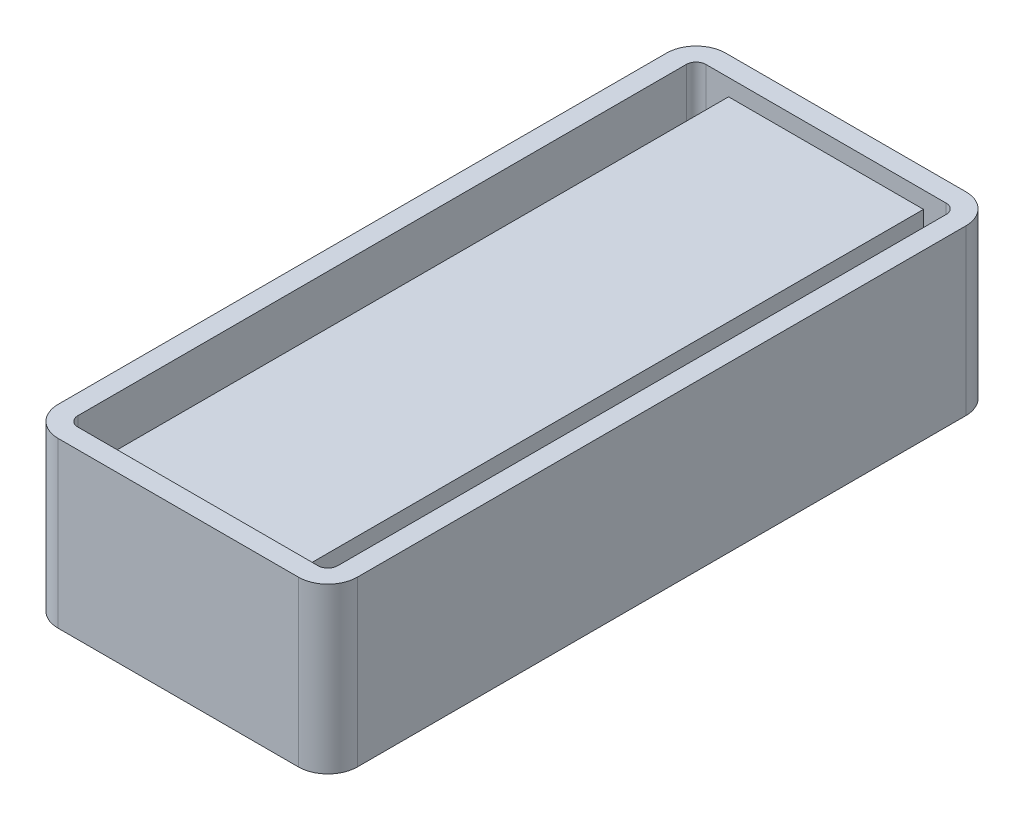
ISO-10303-21;
HEADER;
FILE_DESCRIPTION(('STEP AP214'),'2;1');
FILE_NAME('part.step','',(''),(''),'','','');
FILE_SCHEMA(('AUTOMOTIVE_DESIGN { 1 0 10303 214 1 1 1 1 }'));
ENDSEC;
DATA;
#1=APPLICATION_CONTEXT('core data for automotive mechanical design processes');
#2=APPLICATION_PROTOCOL_DEFINITION('international standard','automotive_design',2000,#1);
#3=PRODUCT_CONTEXT('',#1,'mechanical');
#4=PRODUCT('Part','Part','',(#3));
#5=PRODUCT_RELATED_PRODUCT_CATEGORY('part','',(#4));
#6=PRODUCT_DEFINITION_FORMATION('','',#4);
#7=PRODUCT_DEFINITION_CONTEXT('part definition',#1,'design');
#8=PRODUCT_DEFINITION('design','',#6,#7);
#9=PRODUCT_DEFINITION_SHAPE('','',#8);
#10=(LENGTH_UNIT() NAMED_UNIT(*) SI_UNIT(.MILLI.,.METRE.));
#11=(NAMED_UNIT(*) PLANE_ANGLE_UNIT() SI_UNIT($,.RADIAN.));
#12=(NAMED_UNIT(*) SI_UNIT($,.STERADIAN.) SOLID_ANGLE_UNIT());
#13=UNCERTAINTY_MEASURE_WITH_UNIT(LENGTH_MEASURE(1.E-05),#10,'distance_accuracy_value','');
#14=(GEOMETRIC_REPRESENTATION_CONTEXT(3) GLOBAL_UNCERTAINTY_ASSIGNED_CONTEXT((#13)) GLOBAL_UNIT_ASSIGNED_CONTEXT((#10,
#11,#12)) REPRESENTATION_CONTEXT('',''));
#15=CARTESIAN_POINT('',(0.,0.,0.));
#16=DIRECTION('',(0.,0.,1.));
#17=DIRECTION('',(1.,0.,0.));
#18=AXIS2_PLACEMENT_3D('',#15,#16,#17);
#19=CARTESIAN_POINT('',(0.,15.,0.));
#20=DIRECTION('',(0.,1.,0.));
#21=DIRECTION('',(0.,0.,1.));
#22=AXIS2_PLACEMENT_3D('',#19,#20,#21);
#23=PLANE('',#22);
#24=DIRECTION('',(0.,0.,1.));
#25=VECTOR('',#24,1.);
#26=CARTESIAN_POINT('',(9.9,15.,0.));
#27=LINE('',#26,#25);
#28=CARTESIAN_POINT('',(9.9,15.,-31.9));
#29=VERTEX_POINT('',#28);
#30=CARTESIAN_POINT('',(9.89999999999998,15.,31.9));
#31=VERTEX_POINT('',#30);
#32=EDGE_CURVE('E245',#29,#31,#27,.T.);
#33=ORIENTED_EDGE('',*,*,#32,.F.);
#34=DIRECTION('',(-1.,0.,0.));
#35=VECTOR('',#34,1.);
#36=CARTESIAN_POINT('',(12.2,15.,-31.9));
#37=LINE('',#36,#35);
#38=CARTESIAN_POINT('',(-9.89999999999999,15.,-31.9));
#39=VERTEX_POINT('',#38);
#40=EDGE_CURVE('E11',#29,#39,#37,.T.);
#41=ORIENTED_EDGE('',*,*,#40,.T.);
#42=DIRECTION('',(0.,0.,1.));
#43=VECTOR('',#42,1.);
#44=CARTESIAN_POINT('',(-9.9,15.,0.));
#45=LINE('',#44,#43);
#46=CARTESIAN_POINT('',(-9.9,15.,31.9));
#47=VERTEX_POINT('',#46);
#48=EDGE_CURVE('E248',#39,#47,#45,.T.);
#49=ORIENTED_EDGE('',*,*,#48,.T.);
#50=DIRECTION('',(1.,0.,0.));
#51=VECTOR('',#50,1.);
#52=CARTESIAN_POINT('',(-12.2,15.,31.9));
#53=LINE('',#52,#51);
#54=EDGE_CURVE('E46',#47,#31,#53,.T.);
#55=ORIENTED_EDGE('',*,*,#54,.T.);
#56=EDGE_LOOP('',(#33,#41,#49,#55));
#57=FACE_BOUND('',#56,.T.);
#58=ADVANCED_FACE('F37',(#57),#23,.T.);
#59=CARTESIAN_POINT('',(0.,15.,-33.9));
#60=DIRECTION('',(0.,0.,-1.));
#61=DIRECTION('',(-1.,0.,0.));
#62=AXIS2_PLACEMENT_3D('',#59,#60,#61);
#63=PLANE('',#62);
#64=DIRECTION('',(1.,0.,0.));
#65=VECTOR('',#64,1.);
#66=CARTESIAN_POINT('',(0.,0.,-33.9));
#67=LINE('',#66,#65);
#68=CARTESIAN_POINT('',(-12.2,0.,-33.9));
#69=VERTEX_POINT('',#68);
#70=CARTESIAN_POINT('',(12.2,0.,-33.9));
#71=VERTEX_POINT('',#70);
#72=EDGE_CURVE('E281',#69,#71,#67,.T.);
#73=ORIENTED_EDGE('',*,*,#72,.F.);
#74=DIRECTION('',(0.,-1.,0.));
#75=VECTOR('',#74,1.);
#76=CARTESIAN_POINT('',(-12.2,15.,-33.9));
#77=LINE('',#76,#75);
#78=CARTESIAN_POINT('',(-12.2,16.7,-33.9));
#79=VERTEX_POINT('',#78);
#80=EDGE_CURVE('E220',#79,#69,#77,.T.);
#81=ORIENTED_EDGE('',*,*,#80,.F.);
#82=DIRECTION('',(-1.,0.,0.));
#83=VECTOR('',#82,1.);
#84=CARTESIAN_POINT('',(12.2,16.7,-33.9));
#85=LINE('',#84,#83);
#86=CARTESIAN_POINT('',(12.2,16.7,-33.9));
#87=VERTEX_POINT('',#86);
#88=EDGE_CURVE('E223',#87,#79,#85,.T.);
#89=ORIENTED_EDGE('',*,*,#88,.F.);
#90=DIRECTION('',(0.,-1.,0.));
#91=VECTOR('',#90,1.);
#92=CARTESIAN_POINT('',(12.2,15.,-33.9));
#93=LINE('',#92,#91);
#94=EDGE_CURVE('E54',#87,#71,#93,.T.);
#95=ORIENTED_EDGE('',*,*,#94,.T.);
#96=EDGE_LOOP('',(#73,#81,#89,#95));
#97=FACE_BOUND('',#96,.T.);
#98=ADVANCED_FACE('F378',(#97),#63,.T.);
#99=CARTESIAN_POINT('',(-12.2,15.,-30.9));
#100=DIRECTION('',(0.,-1.,0.));
#101=DIRECTION('',(0.,0.,-1.));
#102=AXIS2_PLACEMENT_3D('',#99,#100,#101);
#103=CYLINDRICAL_SURFACE('',#102,3.);
#104=CARTESIAN_POINT('',(-12.2,0.,-30.9));
#105=DIRECTION('',(0.,1.,0.));
#106=DIRECTION('',(0.,0.,1.));
#107=AXIS2_PLACEMENT_3D('',#104,#105,#106);
#108=CIRCLE('',#107,3.);
#109=CARTESIAN_POINT('',(-15.2,0.,-30.9));
#110=VERTEX_POINT('',#109);
#111=EDGE_CURVE('E283',#69,#110,#108,.T.);
#112=ORIENTED_EDGE('',*,*,#111,.T.);
#113=DIRECTION('',(0.,-1.,0.));
#114=VECTOR('',#113,1.);
#115=CARTESIAN_POINT('',(-15.2,15.,-30.9));
#116=LINE('',#115,#114);
#117=CARTESIAN_POINT('',(-15.2,16.7,-30.9));
#118=VERTEX_POINT('',#117);
#119=EDGE_CURVE('E317',#118,#110,#116,.T.);
#120=ORIENTED_EDGE('',*,*,#119,.F.);
#121=CARTESIAN_POINT('',(-12.2,16.7,-30.9));
#122=DIRECTION('',(0.,1.,0.));
#123=DIRECTION('',(0.,0.,1.));
#124=AXIS2_PLACEMENT_3D('',#121,#122,#123);
#125=CIRCLE('',#124,3.);
#126=EDGE_CURVE('E226',#79,#118,#125,.T.);
#127=ORIENTED_EDGE('',*,*,#126,.F.);
#128=ORIENTED_EDGE('',*,*,#80,.T.);
#129=EDGE_LOOP('',(#112,#120,#127,#128));
#130=FACE_BOUND('',#129,.T.);
#131=ADVANCED_FACE('F383',(#130),#103,.T.);
#132=CARTESIAN_POINT('',(-15.2,15.,0.));
#133=DIRECTION('',(1.,0.,0.));
#134=DIRECTION('',(0.,0.,-1.));
#135=AXIS2_PLACEMENT_3D('',#132,#133,#134);
#136=PLANE('',#135);
#137=DIRECTION('',(0.,0.,1.));
#138=VECTOR('',#137,1.);
#139=CARTESIAN_POINT('',(-15.2,0.,0.));
#140=LINE('',#139,#138);
#141=CARTESIAN_POINT('',(-15.2,0.,30.9));
#142=VERTEX_POINT('',#141);
#143=EDGE_CURVE('E286',#110,#142,#140,.T.);
#144=ORIENTED_EDGE('',*,*,#143,.T.);
#145=DIRECTION('',(0.,-1.,0.));
#146=VECTOR('',#145,1.);
#147=CARTESIAN_POINT('',(-15.2,15.,30.9));
#148=LINE('',#147,#146);
#149=CARTESIAN_POINT('',(-15.2,16.7,30.9));
#150=VERTEX_POINT('',#149);
#151=EDGE_CURVE('E314',#150,#142,#148,.T.);
#152=ORIENTED_EDGE('',*,*,#151,.F.);
#153=DIRECTION('',(0.,0.,1.));
#154=VECTOR('',#153,1.);
#155=CARTESIAN_POINT('',(-15.2,16.7,-30.9));
#156=LINE('',#155,#154);
#157=EDGE_CURVE('E229',#118,#150,#156,.T.);
#158=ORIENTED_EDGE('',*,*,#157,.F.);
#159=ORIENTED_EDGE('',*,*,#119,.T.);
#160=EDGE_LOOP('',(#144,#152,#158,#159));
#161=FACE_BOUND('',#160,.T.);
#162=ADVANCED_FACE('F407',(#161),#136,.F.);
#163=CARTESIAN_POINT('',(-12.2,15.,30.9));
#164=DIRECTION('',(0.,-1.,0.));
#165=DIRECTION('',(0.,0.,-1.));
#166=AXIS2_PLACEMENT_3D('',#163,#164,#165);
#167=CYLINDRICAL_SURFACE('',#166,3.);
#168=CARTESIAN_POINT('',(-12.2,0.,30.9));
#169=DIRECTION('',(0.,1.,0.));
#170=DIRECTION('',(0.,0.,1.));
#171=AXIS2_PLACEMENT_3D('',#168,#169,#170);
#172=CIRCLE('',#171,3.);
#173=CARTESIAN_POINT('',(-12.2,0.,33.9));
#174=VERTEX_POINT('',#173);
#175=EDGE_CURVE('E289',#142,#174,#172,.T.);
#176=ORIENTED_EDGE('',*,*,#175,.T.);
#177=DIRECTION('',(0.,-1.,0.));
#178=VECTOR('',#177,1.);
#179=CARTESIAN_POINT('',(-12.2,15.,33.9));
#180=LINE('',#179,#178);
#181=CARTESIAN_POINT('',(-12.2,16.7,33.9));
#182=VERTEX_POINT('',#181);
#183=EDGE_CURVE('E311',#182,#174,#180,.T.);
#184=ORIENTED_EDGE('',*,*,#183,.F.);
#185=CARTESIAN_POINT('',(-12.2,16.7,30.9));
#186=DIRECTION('',(0.,1.,0.));
#187=DIRECTION('',(0.,0.,1.));
#188=AXIS2_PLACEMENT_3D('',#185,#186,#187);
#189=CIRCLE('',#188,3.);
#190=EDGE_CURVE('E232',#150,#182,#189,.T.);
#191=ORIENTED_EDGE('',*,*,#190,.F.);
#192=ORIENTED_EDGE('',*,*,#151,.T.);
#193=EDGE_LOOP('',(#176,#184,#191,#192));
#194=FACE_BOUND('',#193,.T.);
#195=ADVANCED_FACE('F403',(#194),#167,.T.);
#196=CARTESIAN_POINT('',(0.,15.,33.9));
#197=DIRECTION('',(0.,0.,-1.));
#198=DIRECTION('',(-1.,0.,0.));
#199=AXIS2_PLACEMENT_3D('',#196,#197,#198);
#200=PLANE('',#199);
#201=DIRECTION('',(1.,0.,0.));
#202=VECTOR('',#201,1.);
#203=CARTESIAN_POINT('',(0.,0.,33.9));
#204=LINE('',#203,#202);
#205=CARTESIAN_POINT('',(12.2,0.,33.9));
#206=VERTEX_POINT('',#205);
#207=EDGE_CURVE('E292',#174,#206,#204,.T.);
#208=ORIENTED_EDGE('',*,*,#207,.T.);
#209=DIRECTION('',(0.,-1.,0.));
#210=VECTOR('',#209,1.);
#211=CARTESIAN_POINT('',(12.2,15.,33.9));
#212=LINE('',#211,#210);
#213=CARTESIAN_POINT('',(12.2,16.7,33.9));
#214=VERTEX_POINT('',#213);
#215=EDGE_CURVE('E308',#214,#206,#212,.T.);
#216=ORIENTED_EDGE('',*,*,#215,.F.);
#217=DIRECTION('',(1.,0.,0.));
#218=VECTOR('',#217,1.);
#219=CARTESIAN_POINT('',(-12.2,16.7,33.9));
#220=LINE('',#219,#218);
#221=EDGE_CURVE('E235',#182,#214,#220,.T.);
#222=ORIENTED_EDGE('',*,*,#221,.F.);
#223=ORIENTED_EDGE('',*,*,#183,.T.);
#224=EDGE_LOOP('',(#208,#216,#222,#223));
#225=FACE_BOUND('',#224,.T.);
#226=ADVANCED_FACE('F399',(#225),#200,.F.);
#227=CARTESIAN_POINT('',(12.2,15.,30.9));
#228=DIRECTION('',(0.,-1.,0.));
#229=DIRECTION('',(0.,0.,-1.));
#230=AXIS2_PLACEMENT_3D('',#227,#228,#229);
#231=CYLINDRICAL_SURFACE('',#230,3.);
#232=CARTESIAN_POINT('',(12.2,0.,30.9));
#233=DIRECTION('',(0.,1.,0.));
#234=DIRECTION('',(0.,0.,1.));
#235=AXIS2_PLACEMENT_3D('',#232,#233,#234);
#236=CIRCLE('',#235,3.);
#237=CARTESIAN_POINT('',(15.2,0.,30.9));
#238=VERTEX_POINT('',#237);
#239=EDGE_CURVE('E295',#206,#238,#236,.T.);
#240=ORIENTED_EDGE('',*,*,#239,.T.);
#241=DIRECTION('',(0.,-1.,0.));
#242=VECTOR('',#241,1.);
#243=CARTESIAN_POINT('',(15.2,15.,30.9));
#244=LINE('',#243,#242);
#245=CARTESIAN_POINT('',(15.2,16.7,30.9));
#246=VERTEX_POINT('',#245);
#247=EDGE_CURVE('E306',#246,#238,#244,.T.);
#248=ORIENTED_EDGE('',*,*,#247,.F.);
#249=CARTESIAN_POINT('',(12.2,16.7,30.9));
#250=DIRECTION('',(0.,1.,0.));
#251=DIRECTION('',(0.,0.,1.));
#252=AXIS2_PLACEMENT_3D('',#249,#250,#251);
#253=CIRCLE('',#252,3.);
#254=EDGE_CURVE('E238',#214,#246,#253,.T.);
#255=ORIENTED_EDGE('',*,*,#254,.F.);
#256=ORIENTED_EDGE('',*,*,#215,.T.);
#257=EDGE_LOOP('',(#240,#248,#255,#256));
#258=FACE_BOUND('',#257,.T.);
#259=ADVANCED_FACE('F395',(#258),#231,.T.);
#260=CARTESIAN_POINT('',(15.2,15.,0.));
#261=DIRECTION('',(1.,0.,0.));
#262=DIRECTION('',(0.,0.,-1.));
#263=AXIS2_PLACEMENT_3D('',#260,#261,#262);
#264=PLANE('',#263);
#265=DIRECTION('',(0.,0.,1.));
#266=VECTOR('',#265,1.);
#267=CARTESIAN_POINT('',(15.2,0.,0.));
#268=LINE('',#267,#266);
#269=CARTESIAN_POINT('',(15.2,0.,-30.9));
#270=VERTEX_POINT('',#269);
#271=EDGE_CURVE('E298',#270,#238,#268,.T.);
#272=ORIENTED_EDGE('',*,*,#271,.F.);
#273=DIRECTION('',(0.,-1.,0.));
#274=VECTOR('',#273,1.);
#275=CARTESIAN_POINT('',(15.2,15.,-30.9));
#276=LINE('',#275,#274);
#277=CARTESIAN_POINT('',(15.2,16.7,-30.9));
#278=VERTEX_POINT('',#277);
#279=EDGE_CURVE('E62',#278,#270,#276,.T.);
#280=ORIENTED_EDGE('',*,*,#279,.F.);
#281=DIRECTION('',(0.,0.,-1.));
#282=VECTOR('',#281,1.);
#283=CARTESIAN_POINT('',(15.2,16.7,30.9));
#284=LINE('',#283,#282);
#285=EDGE_CURVE('E241',#246,#278,#284,.T.);
#286=ORIENTED_EDGE('',*,*,#285,.F.);
#287=ORIENTED_EDGE('',*,*,#247,.T.);
#288=EDGE_LOOP('',(#272,#280,#286,#287));
#289=FACE_BOUND('',#288,.T.);
#290=ADVANCED_FACE('F392',(#289),#264,.T.);
#291=CARTESIAN_POINT('',(0.,15.,-31.9));
#292=DIRECTION('',(0.,0.,-1.));
#293=DIRECTION('',(-1.,0.,0.));
#294=AXIS2_PLACEMENT_3D('',#291,#292,#293);
#295=PLANE('',#294);
#296=DIRECTION('',(1.,0.,0.));
#297=VECTOR('',#296,1.);
#298=CARTESIAN_POINT('',(0.,0.,-31.9));
#299=LINE('',#298,#297);
#300=CARTESIAN_POINT('',(-12.2,0.,-31.9));
#301=VERTEX_POINT('',#300);
#302=CARTESIAN_POINT('',(-9.9,0.,-31.9));
#303=VERTEX_POINT('',#302);
#304=EDGE_CURVE('E257',#301,#303,#299,.T.);
#305=ORIENTED_EDGE('',*,*,#304,.T.);
#306=DIRECTION('',(0.,-1.,0.));
#307=VECTOR('',#306,1.);
#308=CARTESIAN_POINT('',(-9.9,15.,-31.9));
#309=LINE('',#308,#307);
#310=EDGE_CURVE('E304',#39,#303,#309,.T.);
#311=ORIENTED_EDGE('',*,*,#310,.F.);
#312=ORIENTED_EDGE('',*,*,#40,.F.);
#313=DIRECTION('',(0.,-1.,0.));
#314=VECTOR('',#313,1.);
#315=CARTESIAN_POINT('',(9.9,15.,-31.9));
#316=LINE('',#315,#314);
#317=CARTESIAN_POINT('',(9.9,0.,-31.9));
#318=VERTEX_POINT('',#317);
#319=EDGE_CURVE('E41',#29,#318,#316,.T.);
#320=ORIENTED_EDGE('',*,*,#319,.T.);
#321=CARTESIAN_POINT('',(12.2,0.,-31.9));
#322=VERTEX_POINT('',#321);
#323=EDGE_CURVE('E185',#318,#322,#299,.T.);
#324=ORIENTED_EDGE('',*,*,#323,.T.);
#325=DIRECTION('',(0.,-1.,0.));
#326=VECTOR('',#325,1.);
#327=CARTESIAN_POINT('',(12.2,15.,-31.9));
#328=LINE('',#327,#326);
#329=CARTESIAN_POINT('',(12.2,16.7,-31.9));
#330=VERTEX_POINT('',#329);
#331=EDGE_CURVE('E177',#330,#322,#328,.T.);
#332=ORIENTED_EDGE('',*,*,#331,.F.);
#333=DIRECTION('',(-1.,0.,0.));
#334=VECTOR('',#333,1.);
#335=CARTESIAN_POINT('',(12.2,16.7,-31.9));
#336=LINE('',#335,#334);
#337=CARTESIAN_POINT('',(-12.2,16.7,-31.9));
#338=VERTEX_POINT('',#337);
#339=EDGE_CURVE('E182',#330,#338,#336,.T.);
#340=ORIENTED_EDGE('',*,*,#339,.T.);
#341=DIRECTION('',(0.,-1.,0.));
#342=VECTOR('',#341,1.);
#343=CARTESIAN_POINT('',(-12.2,15.,-31.9));
#344=LINE('',#343,#342);
#345=EDGE_CURVE('E321',#338,#301,#344,.T.);
#346=ORIENTED_EDGE('',*,*,#345,.T.);
#347=EDGE_LOOP('',(#305,#311,#312,#320,#324,#332,#340,#346));
#348=FACE_BOUND('',#347,.T.);
#349=ADVANCED_FACE('F180',(#348),#295,.F.);
#350=CARTESIAN_POINT('',(-9.9,15.,0.));
#351=DIRECTION('',(1.,0.,0.));
#352=DIRECTION('',(0.,0.,-1.));
#353=AXIS2_PLACEMENT_3D('',#350,#351,#352);
#354=PLANE('',#353);
#355=DIRECTION('',(0.,0.,1.));
#356=VECTOR('',#355,1.);
#357=CARTESIAN_POINT('',(-9.9,0.,0.));
#358=LINE('',#357,#356);
#359=CARTESIAN_POINT('',(-9.9,0.,31.9));
#360=VERTEX_POINT('',#359);
#361=EDGE_CURVE('E269',#303,#360,#358,.T.);
#362=ORIENTED_EDGE('',*,*,#361,.T.);
#363=DIRECTION('',(0.,-1.,0.));
#364=VECTOR('',#363,1.);
#365=CARTESIAN_POINT('',(-9.9,15.,31.9));
#366=LINE('',#365,#364);
#367=EDGE_CURVE('E329',#47,#360,#366,.T.);
#368=ORIENTED_EDGE('',*,*,#367,.F.);
#369=ORIENTED_EDGE('',*,*,#48,.F.);
#370=ORIENTED_EDGE('',*,*,#310,.T.);
#371=EDGE_LOOP('',(#362,#368,#369,#370));
#372=FACE_BOUND('',#371,.T.);
#373=ADVANCED_FACE('F370',(#372),#354,.F.);
#374=CARTESIAN_POINT('',(0.,15.,31.9));
#375=DIRECTION('',(0.,0.,-1.));
#376=DIRECTION('',(-1.,0.,0.));
#377=AXIS2_PLACEMENT_3D('',#374,#375,#376);
#378=PLANE('',#377);
#379=DIRECTION('',(1.,0.,0.));
#380=VECTOR('',#379,1.);
#381=CARTESIAN_POINT('',(0.,0.,31.9));
#382=LINE('',#381,#380);
#383=CARTESIAN_POINT('',(-12.2,0.,31.9));
#384=VERTEX_POINT('',#383);
#385=EDGE_CURVE('E268',#384,#360,#382,.T.);
#386=ORIENTED_EDGE('',*,*,#385,.F.);
#387=DIRECTION('',(0.,-1.,0.));
#388=VECTOR('',#387,1.);
#389=CARTESIAN_POINT('',(-12.2,15.,31.9));
#390=LINE('',#389,#388);
#391=CARTESIAN_POINT('',(-12.2,16.7,31.9));
#392=VERTEX_POINT('',#391);
#393=EDGE_CURVE('E327',#392,#384,#390,.T.);
#394=ORIENTED_EDGE('',*,*,#393,.F.);
#395=DIRECTION('',(1.,0.,0.));
#396=VECTOR('',#395,1.);
#397=CARTESIAN_POINT('',(-12.2,16.7,31.9));
#398=LINE('',#397,#396);
#399=CARTESIAN_POINT('',(12.2,16.7,31.9));
#400=VERTEX_POINT('',#399);
#401=EDGE_CURVE('E210',#392,#400,#398,.T.);
#402=ORIENTED_EDGE('',*,*,#401,.T.);
#403=DIRECTION('',(0.,-1.,0.));
#404=VECTOR('',#403,1.);
#405=CARTESIAN_POINT('',(12.2,15.,31.9));
#406=LINE('',#405,#404);
#407=CARTESIAN_POINT('',(12.2,0.,31.9));
#408=VERTEX_POINT('',#407);
#409=EDGE_CURVE('E334',#400,#408,#406,.T.);
#410=ORIENTED_EDGE('',*,*,#409,.T.);
#411=CARTESIAN_POINT('',(9.9,0.,31.9));
#412=VERTEX_POINT('',#411);
#413=EDGE_CURVE('E265',#412,#408,#382,.T.);
#414=ORIENTED_EDGE('',*,*,#413,.F.);
#415=DIRECTION('',(0.,-1.,0.));
#416=VECTOR('',#415,1.);
#417=CARTESIAN_POINT('',(9.9,15.,31.9));
#418=LINE('',#417,#416);
#419=EDGE_CURVE('E252',#31,#412,#418,.T.);
#420=ORIENTED_EDGE('',*,*,#419,.F.);
#421=ORIENTED_EDGE('',*,*,#54,.F.);
#422=ORIENTED_EDGE('',*,*,#367,.T.);
#423=EDGE_LOOP('',(#386,#394,#402,#410,#414,#420,#421,#422));
#424=FACE_BOUND('',#423,.T.);
#425=ADVANCED_FACE('F353',(#424),#378,.T.);
#426=CARTESIAN_POINT('',(-12.2,15.,30.9));
#427=DIRECTION('',(0.,-1.,0.));
#428=DIRECTION('',(0.,0.,-1.));
#429=AXIS2_PLACEMENT_3D('',#426,#427,#428);
#430=CYLINDRICAL_SURFACE('',#429,1.);
#431=CARTESIAN_POINT('',(-12.2,0.,30.9));
#432=DIRECTION('',(0.,1.,0.));
#433=DIRECTION('',(0.,0.,1.));
#434=AXIS2_PLACEMENT_3D('',#431,#432,#433);
#435=CIRCLE('',#434,1.);
#436=CARTESIAN_POINT('',(-13.2,0.,30.9));
#437=VERTEX_POINT('',#436);
#438=EDGE_CURVE('E272',#437,#384,#435,.T.);
#439=ORIENTED_EDGE('',*,*,#438,.F.);
#440=DIRECTION('',(0.,-1.,0.));
#441=VECTOR('',#440,1.);
#442=CARTESIAN_POINT('',(-13.2,15.,30.9));
#443=LINE('',#442,#441);
#444=CARTESIAN_POINT('',(-13.2,16.7,30.9));
#445=VERTEX_POINT('',#444);
#446=EDGE_CURVE('E325',#445,#437,#443,.T.);
#447=ORIENTED_EDGE('',*,*,#446,.F.);
#448=CARTESIAN_POINT('',(-12.2,16.7,30.9));
#449=DIRECTION('',(0.,1.,0.));
#450=DIRECTION('',(0.,0.,1.));
#451=AXIS2_PLACEMENT_3D('',#448,#449,#450);
#452=CIRCLE('',#451,0.999999999999997);
#453=EDGE_CURVE('E207',#445,#392,#452,.T.);
#454=ORIENTED_EDGE('',*,*,#453,.T.);
#455=ORIENTED_EDGE('',*,*,#393,.T.);
#456=EDGE_LOOP('',(#439,#447,#454,#455));
#457=FACE_BOUND('',#456,.T.);
#458=ADVANCED_FACE('F357',(#457),#430,.F.);
#459=CARTESIAN_POINT('',(-13.2,15.,0.));
#460=DIRECTION('',(1.,0.,0.));
#461=DIRECTION('',(0.,0.,-1.));
#462=AXIS2_PLACEMENT_3D('',#459,#460,#461);
#463=PLANE('',#462);
#464=DIRECTION('',(0.,0.,1.));
#465=VECTOR('',#464,1.);
#466=CARTESIAN_POINT('',(-13.2,0.,0.));
#467=LINE('',#466,#465);
#468=CARTESIAN_POINT('',(-13.2,0.,-30.9));
#469=VERTEX_POINT('',#468);
#470=EDGE_CURVE('E275',#469,#437,#467,.T.);
#471=ORIENTED_EDGE('',*,*,#470,.F.);
#472=DIRECTION('',(0.,-1.,0.));
#473=VECTOR('',#472,1.);
#474=CARTESIAN_POINT('',(-13.2,15.,-30.9));
#475=LINE('',#474,#473);
#476=CARTESIAN_POINT('',(-13.2,16.7,-30.9));
#477=VERTEX_POINT('',#476);
#478=EDGE_CURVE('E323',#477,#469,#475,.T.);
#479=ORIENTED_EDGE('',*,*,#478,.F.);
#480=DIRECTION('',(0.,0.,1.));
#481=VECTOR('',#480,1.);
#482=CARTESIAN_POINT('',(-13.2,16.7,-30.9));
#483=LINE('',#482,#481);
#484=EDGE_CURVE('E202',#477,#445,#483,.T.);
#485=ORIENTED_EDGE('',*,*,#484,.T.);
#486=ORIENTED_EDGE('',*,*,#446,.T.);
#487=EDGE_LOOP('',(#471,#479,#485,#486));
#488=FACE_BOUND('',#487,.T.);
#489=ADVANCED_FACE('F360',(#488),#463,.T.);
#490=CARTESIAN_POINT('',(9.9,15.,0.));
#491=DIRECTION('',(1.,0.,0.));
#492=DIRECTION('',(0.,0.,-1.));
#493=AXIS2_PLACEMENT_3D('',#490,#491,#492);
#494=PLANE('',#493);
#495=DIRECTION('',(0.,0.,1.));
#496=VECTOR('',#495,1.);
#497=CARTESIAN_POINT('',(9.9,0.,0.));
#498=LINE('',#497,#496);
#499=EDGE_CURVE('E244',#318,#412,#498,.T.);
#500=ORIENTED_EDGE('',*,*,#499,.F.);
#501=ORIENTED_EDGE('',*,*,#319,.F.);
#502=ORIENTED_EDGE('',*,*,#32,.T.);
#503=ORIENTED_EDGE('',*,*,#419,.T.);
#504=EDGE_LOOP('',(#500,#501,#502,#503));
#505=FACE_BOUND('',#504,.T.);
#506=ADVANCED_FACE('F39',(#505),#494,.T.);
#507=CARTESIAN_POINT('',(12.2,15.,-30.9));
#508=DIRECTION('',(0.,-1.,0.));
#509=DIRECTION('',(0.,0.,-1.));
#510=AXIS2_PLACEMENT_3D('',#507,#508,#509);
#511=CYLINDRICAL_SURFACE('',#510,1.);
#512=CARTESIAN_POINT('',(12.2,0.,-30.9));
#513=DIRECTION('',(0.,1.,0.));
#514=DIRECTION('',(0.,0.,1.));
#515=AXIS2_PLACEMENT_3D('',#512,#513,#514);
#516=CIRCLE('',#515,1.);
#517=CARTESIAN_POINT('',(13.2,0.,-30.9));
#518=VERTEX_POINT('',#517);
#519=EDGE_CURVE('E256',#322,#518,#516,.F.);
#520=ORIENTED_EDGE('',*,*,#519,.T.);
#521=DIRECTION('',(0.,-1.,0.));
#522=VECTOR('',#521,1.);
#523=CARTESIAN_POINT('',(13.2,15.,-30.9));
#524=LINE('',#523,#522);
#525=CARTESIAN_POINT('',(13.2,16.7,-30.9));
#526=VERTEX_POINT('',#525);
#527=EDGE_CURVE('E188',#526,#518,#524,.T.);
#528=ORIENTED_EDGE('',*,*,#527,.F.);
#529=CARTESIAN_POINT('',(12.2,16.7,-30.9));
#530=DIRECTION('',(0.,1.,0.));
#531=DIRECTION('',(0.,0.,1.));
#532=AXIS2_PLACEMENT_3D('',#529,#530,#531);
#533=CIRCLE('',#532,1.);
#534=EDGE_CURVE('E190',#526,#330,#533,.T.);
#535=ORIENTED_EDGE('',*,*,#534,.T.);
#536=ORIENTED_EDGE('',*,*,#331,.T.);
#537=EDGE_LOOP('',(#520,#528,#535,#536));
#538=FACE_BOUND('',#537,.T.);
#539=ADVANCED_FACE('F191',(#538),#511,.F.);
#540=CARTESIAN_POINT('',(13.2,15.,0.));
#541=DIRECTION('',(1.,0.,0.));
#542=DIRECTION('',(0.,0.,-1.));
#543=AXIS2_PLACEMENT_3D('',#540,#541,#542);
#544=PLANE('',#543);
#545=DIRECTION('',(0.,0.,1.));
#546=VECTOR('',#545,1.);
#547=CARTESIAN_POINT('',(13.2,0.,0.));
#548=LINE('',#547,#546);
#549=CARTESIAN_POINT('',(13.2,0.,30.9));
#550=VERTEX_POINT('',#549);
#551=EDGE_CURVE('E259',#518,#550,#548,.T.);
#552=ORIENTED_EDGE('',*,*,#551,.T.);
#553=DIRECTION('',(0.,-1.,0.));
#554=VECTOR('',#553,1.);
#555=CARTESIAN_POINT('',(13.2,15.,30.9));
#556=LINE('',#555,#554);
#557=CARTESIAN_POINT('',(13.2,16.7,30.9));
#558=VERTEX_POINT('',#557);
#559=EDGE_CURVE('E336',#558,#550,#556,.T.);
#560=ORIENTED_EDGE('',*,*,#559,.F.);
#561=DIRECTION('',(0.,0.,-1.));
#562=VECTOR('',#561,1.);
#563=CARTESIAN_POINT('',(13.2,16.7,30.9));
#564=LINE('',#563,#562);
#565=EDGE_CURVE('E216',#558,#526,#564,.T.);
#566=ORIENTED_EDGE('',*,*,#565,.T.);
#567=ORIENTED_EDGE('',*,*,#527,.T.);
#568=EDGE_LOOP('',(#552,#560,#566,#567));
#569=FACE_BOUND('',#568,.T.);
#570=ADVANCED_FACE('F340',(#569),#544,.F.);
#571=CARTESIAN_POINT('',(12.2,15.,30.9));
#572=DIRECTION('',(0.,-1.,0.));
#573=DIRECTION('',(0.,0.,-1.));
#574=AXIS2_PLACEMENT_3D('',#571,#572,#573);
#575=CYLINDRICAL_SURFACE('',#574,1.);
#576=CARTESIAN_POINT('',(12.2,0.,30.9));
#577=DIRECTION('',(0.,1.,0.));
#578=DIRECTION('',(0.,0.,1.));
#579=AXIS2_PLACEMENT_3D('',#576,#577,#578);
#580=CIRCLE('',#579,1.);
#581=EDGE_CURVE('E262',#408,#550,#580,.T.);
#582=ORIENTED_EDGE('',*,*,#581,.F.);
#583=ORIENTED_EDGE('',*,*,#409,.F.);
#584=CARTESIAN_POINT('',(12.2,16.7,30.9));
#585=DIRECTION('',(0.,1.,0.));
#586=DIRECTION('',(0.,0.,1.));
#587=AXIS2_PLACEMENT_3D('',#584,#585,#586);
#588=CIRCLE('',#587,1.);
#589=EDGE_CURVE('E213',#400,#558,#588,.T.);
#590=ORIENTED_EDGE('',*,*,#589,.T.);
#591=ORIENTED_EDGE('',*,*,#559,.T.);
#592=EDGE_LOOP('',(#582,#583,#590,#591));
#593=FACE_BOUND('',#592,.T.);
#594=ADVANCED_FACE('F347',(#593),#575,.F.);
#595=CARTESIAN_POINT('',(-12.2,15.,-30.9));
#596=DIRECTION('',(0.,-1.,0.));
#597=DIRECTION('',(0.,0.,-1.));
#598=AXIS2_PLACEMENT_3D('',#595,#596,#597);
#599=CYLINDRICAL_SURFACE('',#598,1.);
#600=CARTESIAN_POINT('',(-12.2,0.,-30.9));
#601=DIRECTION('',(0.,1.,0.));
#602=DIRECTION('',(0.,0.,1.));
#603=AXIS2_PLACEMENT_3D('',#600,#601,#602);
#604=CIRCLE('',#603,1.);
#605=EDGE_CURVE('E278',#301,#469,#604,.T.);
#606=ORIENTED_EDGE('',*,*,#605,.F.);
#607=ORIENTED_EDGE('',*,*,#345,.F.);
#608=CARTESIAN_POINT('',(-12.2,16.7,-30.9));
#609=DIRECTION('',(0.,1.,0.));
#610=DIRECTION('',(0.,0.,1.));
#611=AXIS2_PLACEMENT_3D('',#608,#609,#610);
#612=CIRCLE('',#611,0.999999999999997);
#613=EDGE_CURVE('E200',#338,#477,#612,.T.);
#614=ORIENTED_EDGE('',*,*,#613,.T.);
#615=ORIENTED_EDGE('',*,*,#478,.T.);
#616=EDGE_LOOP('',(#606,#607,#614,#615));
#617=FACE_BOUND('',#616,.T.);
#618=ADVANCED_FACE('F363',(#617),#599,.F.);
#619=CARTESIAN_POINT('',(12.2,15.,-30.9));
#620=DIRECTION('',(0.,-1.,0.));
#621=DIRECTION('',(0.,0.,-1.));
#622=AXIS2_PLACEMENT_3D('',#619,#620,#621);
#623=CYLINDRICAL_SURFACE('',#622,3.);
#624=CARTESIAN_POINT('',(12.2,0.,-30.9));
#625=DIRECTION('',(0.,1.,0.));
#626=DIRECTION('',(0.,0.,1.));
#627=AXIS2_PLACEMENT_3D('',#624,#625,#626);
#628=CIRCLE('',#627,3.);
#629=EDGE_CURVE('E249',#71,#270,#628,.F.);
#630=ORIENTED_EDGE('',*,*,#629,.F.);
#631=ORIENTED_EDGE('',*,*,#94,.F.);
#632=CARTESIAN_POINT('',(12.2,16.7,-30.9));
#633=DIRECTION('',(0.,1.,0.));
#634=DIRECTION('',(0.,0.,1.));
#635=AXIS2_PLACEMENT_3D('',#632,#633,#634);
#636=CIRCLE('',#635,3.);
#637=EDGE_CURVE('E217',#278,#87,#636,.T.);
#638=ORIENTED_EDGE('',*,*,#637,.F.);
#639=ORIENTED_EDGE('',*,*,#279,.T.);
#640=EDGE_LOOP('',(#630,#631,#638,#639));
#641=FACE_BOUND('',#640,.T.);
#642=ADVANCED_FACE('F389',(#641),#623,.T.);
#643=CARTESIAN_POINT('',(0.,0.,0.));
#644=DIRECTION('',(0.,1.,0.));
#645=DIRECTION('',(0.,0.,1.));
#646=AXIS2_PLACEMENT_3D('',#643,#644,#645);
#647=PLANE('',#646);
#648=ORIENTED_EDGE('',*,*,#499,.T.);
#649=ORIENTED_EDGE('',*,*,#413,.T.);
#650=ORIENTED_EDGE('',*,*,#581,.T.);
#651=ORIENTED_EDGE('',*,*,#551,.F.);
#652=ORIENTED_EDGE('',*,*,#519,.F.);
#653=ORIENTED_EDGE('',*,*,#323,.F.);
#654=EDGE_LOOP('',(#648,#649,#650,#651,#652,#653));
#655=FACE_BOUND('',#654,.T.);
#656=ORIENTED_EDGE('',*,*,#304,.F.);
#657=ORIENTED_EDGE('',*,*,#605,.T.);
#658=ORIENTED_EDGE('',*,*,#470,.T.);
#659=ORIENTED_EDGE('',*,*,#438,.T.);
#660=ORIENTED_EDGE('',*,*,#385,.T.);
#661=ORIENTED_EDGE('',*,*,#361,.F.);
#662=EDGE_LOOP('',(#656,#657,#658,#659,#660,#661));
#663=FACE_BOUND('',#662,.T.);
#664=ORIENTED_EDGE('',*,*,#72,.T.);
#665=ORIENTED_EDGE('',*,*,#629,.T.);
#666=ORIENTED_EDGE('',*,*,#271,.T.);
#667=ORIENTED_EDGE('',*,*,#239,.F.);
#668=ORIENTED_EDGE('',*,*,#207,.F.);
#669=ORIENTED_EDGE('',*,*,#175,.F.);
#670=ORIENTED_EDGE('',*,*,#143,.F.);
#671=ORIENTED_EDGE('',*,*,#111,.F.);
#672=EDGE_LOOP('',(#664,#665,#666,#667,#668,#669,#670,#671));
#673=FACE_BOUND('',#672,.T.);
#674=ADVANCED_FACE('F342',(#655,#663,#673),#647,.F.);
#675=CARTESIAN_POINT('',(12.2,16.7,-30.9));
#676=DIRECTION('',(0.,1.,0.));
#677=DIRECTION('',(0.,0.,1.));
#678=AXIS2_PLACEMENT_3D('',#675,#676,#677);
#679=PLANE('',#678);
#680=ORIENTED_EDGE('',*,*,#637,.T.);
#681=ORIENTED_EDGE('',*,*,#88,.T.);
#682=ORIENTED_EDGE('',*,*,#126,.T.);
#683=ORIENTED_EDGE('',*,*,#157,.T.);
#684=ORIENTED_EDGE('',*,*,#190,.T.);
#685=ORIENTED_EDGE('',*,*,#221,.T.);
#686=ORIENTED_EDGE('',*,*,#254,.T.);
#687=ORIENTED_EDGE('',*,*,#285,.T.);
#688=EDGE_LOOP('',(#680,#681,#682,#683,#684,#685,#686,#687));
#689=FACE_BOUND('',#688,.T.);
#690=ORIENTED_EDGE('',*,*,#339,.F.);
#691=ORIENTED_EDGE('',*,*,#534,.F.);
#692=ORIENTED_EDGE('',*,*,#565,.F.);
#693=ORIENTED_EDGE('',*,*,#589,.F.);
#694=ORIENTED_EDGE('',*,*,#401,.F.);
#695=ORIENTED_EDGE('',*,*,#453,.F.);
#696=ORIENTED_EDGE('',*,*,#484,.F.);
#697=ORIENTED_EDGE('',*,*,#613,.F.);
#698=EDGE_LOOP('',(#690,#691,#692,#693,#694,#695,#696,#697));
#699=FACE_BOUND('',#698,.T.);
#700=ADVANCED_FACE('F197',(#689,#699),#679,.T.);
#701=CLOSED_SHELL('',(#58,#98,#131,#162,#195,#226,#259,#290,#349,#373,#425,#458,#489,#506,#539,
#570,#594,#618,#642,#674,#700));
#702=MANIFOLD_SOLID_BREP('B2',#701);
#703=ADVANCED_BREP_SHAPE_REPRESENTATION('',(#18,#702),#14);
#704=SHAPE_DEFINITION_REPRESENTATION(#9,#703);
ENDSEC;
END-ISO-10303-21;
